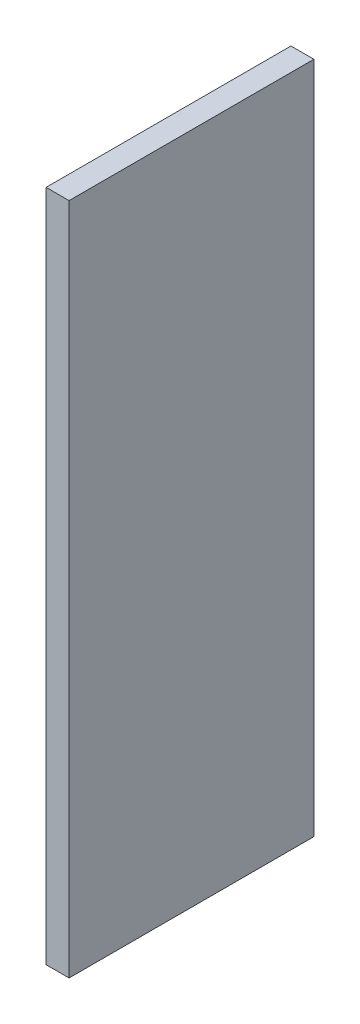
ISO-10303-21;
HEADER;
FILE_DESCRIPTION(('STEP AP214'),'2;1');
FILE_NAME('part.step','',(''),(''),'','','');
FILE_SCHEMA(('AUTOMOTIVE_DESIGN { 1 0 10303 214 1 1 1 1 }'));
ENDSEC;
DATA;
#1=APPLICATION_CONTEXT('core data for automotive mechanical design processes');
#2=APPLICATION_PROTOCOL_DEFINITION('international standard','automotive_design',2000,#1);
#3=PRODUCT_CONTEXT('',#1,'mechanical');
#4=PRODUCT('Part','Part','',(#3));
#5=PRODUCT_RELATED_PRODUCT_CATEGORY('part','',(#4));
#6=PRODUCT_DEFINITION_FORMATION('','',#4);
#7=PRODUCT_DEFINITION_CONTEXT('part definition',#1,'design');
#8=PRODUCT_DEFINITION('design','',#6,#7);
#9=PRODUCT_DEFINITION_SHAPE('','',#8);
#10=(LENGTH_UNIT() NAMED_UNIT(*) SI_UNIT(.MILLI.,.METRE.));
#11=(NAMED_UNIT(*) PLANE_ANGLE_UNIT() SI_UNIT($,.RADIAN.));
#12=(NAMED_UNIT(*) SI_UNIT($,.STERADIAN.) SOLID_ANGLE_UNIT());
#13=UNCERTAINTY_MEASURE_WITH_UNIT(LENGTH_MEASURE(1.E-05),#10,'distance_accuracy_value','');
#14=(GEOMETRIC_REPRESENTATION_CONTEXT(3) GLOBAL_UNCERTAINTY_ASSIGNED_CONTEXT((#13)) GLOBAL_UNIT_ASSIGNED_CONTEXT((#10,
#11,#12)) REPRESENTATION_CONTEXT('',''));
#15=CARTESIAN_POINT('',(0.,0.,0.));
#16=DIRECTION('',(0.,0.,1.));
#17=DIRECTION('',(1.,0.,0.));
#18=AXIS2_PLACEMENT_3D('',#15,#16,#17);
#19=CARTESIAN_POINT('',(19.05,-47.9803875482156,30.4666339184487));
#20=DIRECTION('',(0.,1.,0.));
#21=DIRECTION('',(0.,0.,1.));
#22=AXIS2_PLACEMENT_3D('',#19,#20,#21);
#23=PLANE('',#22);
#24=DIRECTION('',(0.,0.,-1.));
#25=VECTOR('',#24,1.);
#26=CARTESIAN_POINT('',(0.,-47.9803875482156,30.4666339184487));
#27=LINE('',#26,#25);
#28=CARTESIAN_POINT('',(0.,-47.9803875482156,30.4666339184487));
#29=VERTEX_POINT('',#28);
#30=CARTESIAN_POINT('',(0.,-47.9803875482156,-172.733366081551));
#31=VERTEX_POINT('',#30);
#32=EDGE_CURVE('E106',#29,#31,#27,.T.);
#33=ORIENTED_EDGE('',*,*,#32,.T.);
#34=DIRECTION('',(-1.,0.,0.));
#35=VECTOR('',#34,1.);
#36=CARTESIAN_POINT('',(19.05,-47.9803875482156,-172.733366081551));
#37=LINE('',#36,#35);
#38=CARTESIAN_POINT('',(19.05,-47.9803875482156,-172.733366081551));
#39=VERTEX_POINT('',#38);
#40=EDGE_CURVE('E11',#39,#31,#37,.T.);
#41=ORIENTED_EDGE('',*,*,#40,.F.);
#42=DIRECTION('',(0.,0.,-1.));
#43=VECTOR('',#42,1.);
#44=CARTESIAN_POINT('',(19.05,-47.9803875482156,30.4666339184487));
#45=LINE('',#44,#43);
#46=CARTESIAN_POINT('',(19.05,-47.9803875482156,30.4666339184487));
#47=VERTEX_POINT('',#46);
#48=EDGE_CURVE('E79',#47,#39,#45,.T.);
#49=ORIENTED_EDGE('',*,*,#48,.F.);
#50=DIRECTION('',(-1.,0.,0.));
#51=VECTOR('',#50,1.);
#52=CARTESIAN_POINT('',(19.05,-47.9803875482156,30.4666339184487));
#53=LINE('',#52,#51);
#54=EDGE_CURVE('E102',#47,#29,#53,.T.);
#55=ORIENTED_EDGE('',*,*,#54,.T.);
#56=EDGE_LOOP('',(#33,#41,#49,#55));
#57=FACE_BOUND('',#56,.T.);
#58=ADVANCED_FACE('F39',(#57),#23,.F.);
#59=CARTESIAN_POINT('',(19.05,510.819612451784,-172.733366081551));
#60=DIRECTION('',(0.,0.,-1.));
#61=DIRECTION('',(0.,1.,0.));
#62=AXIS2_PLACEMENT_3D('',#59,#60,#61);
#63=PLANE('',#62);
#64=DIRECTION('',(0.,-1.,0.));
#65=VECTOR('',#64,1.);
#66=CARTESIAN_POINT('',(0.,510.819612451784,-172.733366081551));
#67=LINE('',#66,#65);
#68=CARTESIAN_POINT('',(0.,510.819612451784,-172.733366081551));
#69=VERTEX_POINT('',#68);
#70=EDGE_CURVE('E88',#69,#31,#67,.T.);
#71=ORIENTED_EDGE('',*,*,#70,.F.);
#72=DIRECTION('',(-1.,0.,0.));
#73=VECTOR('',#72,1.);
#74=CARTESIAN_POINT('',(19.05,510.819612451784,-172.733366081551));
#75=LINE('',#74,#73);
#76=CARTESIAN_POINT('',(19.05,510.819612451784,-172.733366081551));
#77=VERTEX_POINT('',#76);
#78=EDGE_CURVE('E48',#77,#69,#75,.T.);
#79=ORIENTED_EDGE('',*,*,#78,.F.);
#80=DIRECTION('',(0.,-1.,0.));
#81=VECTOR('',#80,1.);
#82=CARTESIAN_POINT('',(19.05,510.819612451784,-172.733366081551));
#83=LINE('',#82,#81);
#84=EDGE_CURVE('E86',#77,#39,#83,.T.);
#85=ORIENTED_EDGE('',*,*,#84,.T.);
#86=ORIENTED_EDGE('',*,*,#40,.T.);
#87=EDGE_LOOP('',(#71,#79,#85,#86));
#88=FACE_BOUND('',#87,.T.);
#89=ADVANCED_FACE('F85',(#88),#63,.T.);
#90=CARTESIAN_POINT('',(19.05,510.819612451784,30.4666339184487));
#91=DIRECTION('',(0.,1.,0.));
#92=DIRECTION('',(0.,0.,1.));
#93=AXIS2_PLACEMENT_3D('',#90,#91,#92);
#94=PLANE('',#93);
#95=DIRECTION('',(0.,0.,-1.));
#96=VECTOR('',#95,1.);
#97=CARTESIAN_POINT('',(0.,510.819612451784,30.4666339184487));
#98=LINE('',#97,#96);
#99=CARTESIAN_POINT('',(0.,510.819612451784,30.4666339184487));
#100=VERTEX_POINT('',#99);
#101=EDGE_CURVE('E112',#100,#69,#98,.T.);
#102=ORIENTED_EDGE('',*,*,#101,.F.);
#103=DIRECTION('',(-1.,0.,0.));
#104=VECTOR('',#103,1.);
#105=CARTESIAN_POINT('',(19.05,510.819612451784,30.4666339184487));
#106=LINE('',#105,#104);
#107=CARTESIAN_POINT('',(19.05,510.819612451784,30.4666339184487));
#108=VERTEX_POINT('',#107);
#109=EDGE_CURVE('E71',#108,#100,#106,.T.);
#110=ORIENTED_EDGE('',*,*,#109,.F.);
#111=DIRECTION('',(0.,0.,-1.));
#112=VECTOR('',#111,1.);
#113=CARTESIAN_POINT('',(19.05,510.819612451784,30.4666339184487));
#114=LINE('',#113,#112);
#115=EDGE_CURVE('E95',#108,#77,#114,.T.);
#116=ORIENTED_EDGE('',*,*,#115,.T.);
#117=ORIENTED_EDGE('',*,*,#78,.T.);
#118=EDGE_LOOP('',(#102,#110,#116,#117));
#119=FACE_BOUND('',#118,.T.);
#120=ADVANCED_FACE('F98',(#119),#94,.T.);
#121=CARTESIAN_POINT('',(19.05,510.819612451784,30.4666339184487));
#122=DIRECTION('',(0.,0.,-1.));
#123=DIRECTION('',(0.,1.,0.));
#124=AXIS2_PLACEMENT_3D('',#121,#122,#123);
#125=PLANE('',#124);
#126=DIRECTION('',(0.,-1.,0.));
#127=VECTOR('',#126,1.);
#128=CARTESIAN_POINT('',(0.,510.819612451784,30.4666339184487));
#129=LINE('',#128,#127);
#130=EDGE_CURVE('E74',#100,#29,#129,.T.);
#131=ORIENTED_EDGE('',*,*,#130,.T.);
#132=ORIENTED_EDGE('',*,*,#54,.F.);
#133=DIRECTION('',(0.,-1.,0.));
#134=VECTOR('',#133,1.);
#135=CARTESIAN_POINT('',(19.05,510.819612451784,30.4666339184487));
#136=LINE('',#135,#134);
#137=EDGE_CURVE('E56',#108,#47,#136,.T.);
#138=ORIENTED_EDGE('',*,*,#137,.F.);
#139=ORIENTED_EDGE('',*,*,#109,.T.);
#140=EDGE_LOOP('',(#131,#132,#138,#139));
#141=FACE_BOUND('',#140,.T.);
#142=ADVANCED_FACE('F129',(#141),#125,.F.);
#143=CARTESIAN_POINT('',(19.05,0.,0.));
#144=DIRECTION('',(-1.,0.,0.));
#145=DIRECTION('',(0.,0.,1.));
#146=AXIS2_PLACEMENT_3D('',#143,#144,#145);
#147=PLANE('',#146);
#148=ORIENTED_EDGE('',*,*,#48,.T.);
#149=ORIENTED_EDGE('',*,*,#84,.F.);
#150=ORIENTED_EDGE('',*,*,#115,.F.);
#151=ORIENTED_EDGE('',*,*,#137,.T.);
#152=EDGE_LOOP('',(#148,#149,#150,#151));
#153=FACE_BOUND('',#152,.T.);
#154=ADVANCED_FACE('F94',(#153),#147,.F.);
#155=CARTESIAN_POINT('',(0.,0.,0.));
#156=DIRECTION('',(-1.,0.,0.));
#157=DIRECTION('',(0.,0.,1.));
#158=AXIS2_PLACEMENT_3D('',#155,#156,#157);
#159=PLANE('',#158);
#160=ORIENTED_EDGE('',*,*,#32,.F.);
#161=ORIENTED_EDGE('',*,*,#130,.F.);
#162=ORIENTED_EDGE('',*,*,#101,.T.);
#163=ORIENTED_EDGE('',*,*,#70,.T.);
#164=EDGE_LOOP('',(#160,#161,#162,#163));
#165=FACE_BOUND('',#164,.T.);
#166=ADVANCED_FACE('F123',(#165),#159,.T.);
#167=CLOSED_SHELL('',(#58,#89,#120,#142,#154,#166));
#168=MANIFOLD_SOLID_BREP('B2',#167);
#169=ADVANCED_BREP_SHAPE_REPRESENTATION('',(#18,#168),#14);
#170=SHAPE_DEFINITION_REPRESENTATION(#9,#169);
ENDSEC;
END-ISO-10303-21;
